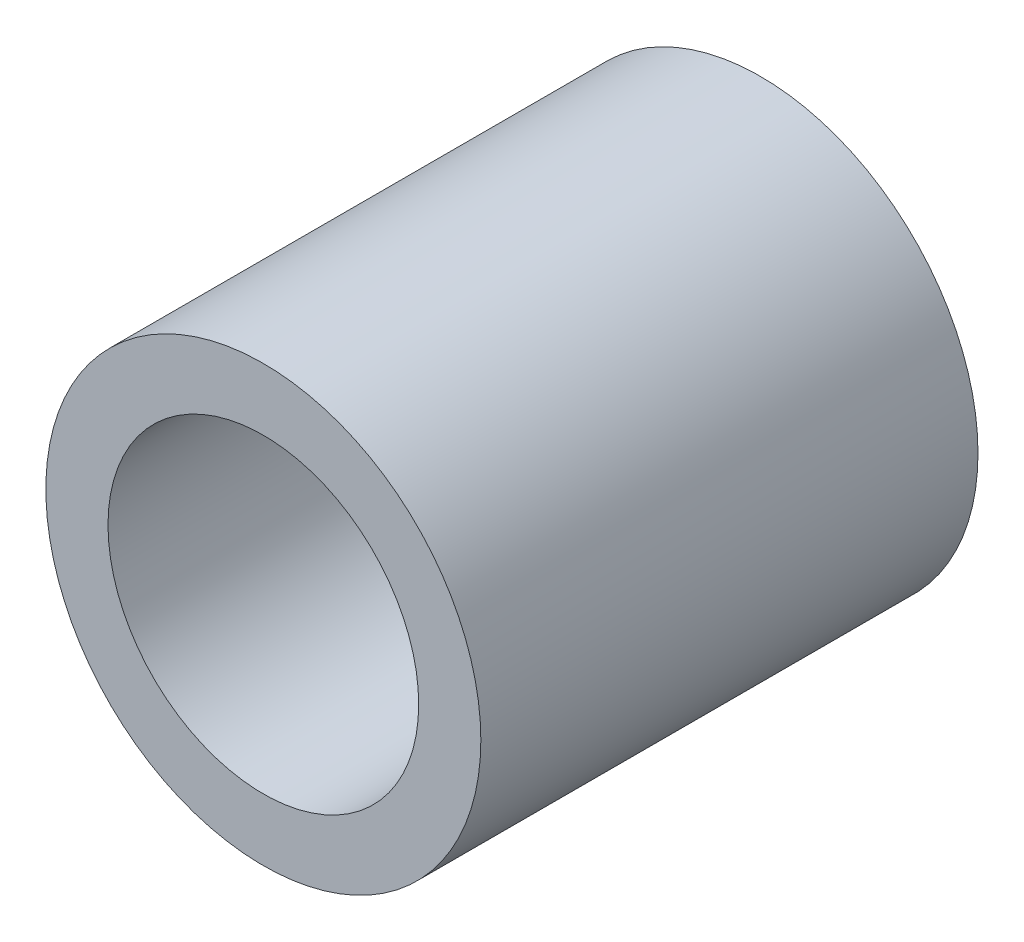
ISO-10303-21;
HEADER;
FILE_DESCRIPTION(('STEP AP214'),'2;1');
FILE_NAME('part.step','',(''),(''),'','','');
FILE_SCHEMA(('AUTOMOTIVE_DESIGN { 1 0 10303 214 1 1 1 1 }'));
ENDSEC;
DATA;
#1=APPLICATION_CONTEXT('core data for automotive mechanical design processes');
#2=APPLICATION_PROTOCOL_DEFINITION('international standard','automotive_design',2000,#1);
#3=PRODUCT_CONTEXT('',#1,'mechanical');
#4=PRODUCT('Part','Part','',(#3));
#5=PRODUCT_RELATED_PRODUCT_CATEGORY('part','',(#4));
#6=PRODUCT_DEFINITION_FORMATION('','',#4);
#7=PRODUCT_DEFINITION_CONTEXT('part definition',#1,'design');
#8=PRODUCT_DEFINITION('design','',#6,#7);
#9=PRODUCT_DEFINITION_SHAPE('','',#8);
#10=(LENGTH_UNIT() NAMED_UNIT(*) SI_UNIT(.MILLI.,.METRE.));
#11=(NAMED_UNIT(*) PLANE_ANGLE_UNIT() SI_UNIT($,.RADIAN.));
#12=(NAMED_UNIT(*) SI_UNIT($,.STERADIAN.) SOLID_ANGLE_UNIT());
#13=UNCERTAINTY_MEASURE_WITH_UNIT(LENGTH_MEASURE(1.E-05),#10,'distance_accuracy_value','');
#14=(GEOMETRIC_REPRESENTATION_CONTEXT(3) GLOBAL_UNCERTAINTY_ASSIGNED_CONTEXT((#13)) GLOBAL_UNIT_ASSIGNED_CONTEXT((#10,
#11,#12)) REPRESENTATION_CONTEXT('',''));
#15=CARTESIAN_POINT('',(0.,0.,0.));
#16=DIRECTION('',(0.,0.,1.));
#17=DIRECTION('',(1.,0.,0.));
#18=AXIS2_PLACEMENT_3D('',#15,#16,#17);
#19=CARTESIAN_POINT('',(0.,0.,25.4));
#20=DIRECTION('',(0.,0.,1.));
#21=DIRECTION('',(1.,0.,0.));
#22=AXIS2_PLACEMENT_3D('',#19,#20,#21);
#23=PLANE('',#22);
#24=CARTESIAN_POINT('',(0.,0.,25.4));
#25=DIRECTION('',(0.,0.,1.));
#26=DIRECTION('',(1.,0.,0.));
#27=AXIS2_PLACEMENT_3D('',#24,#25,#26);
#28=CIRCLE('',#27,11.1125);
#29=CARTESIAN_POINT('',(11.1125,0.,25.4));
#30=VERTEX_POINT('',#29);
#31=EDGE_CURVE('E10',#30,#30,#28,.T.);
#32=ORIENTED_EDGE('',*,*,#31,.T.);
#33=EDGE_LOOP('',(#32));
#34=FACE_BOUND('',#33,.T.);
#35=CARTESIAN_POINT('',(0.,0.,25.4));
#36=DIRECTION('',(0.,0.,1.));
#37=DIRECTION('',(1.,0.,0.));
#38=AXIS2_PLACEMENT_3D('',#35,#36,#37);
#39=CIRCLE('',#38,7.9375);
#40=CARTESIAN_POINT('',(7.9375,0.,25.4));
#41=VERTEX_POINT('',#40);
#42=EDGE_CURVE('E56',#41,#41,#39,.T.);
#43=ORIENTED_EDGE('',*,*,#42,.F.);
#44=EDGE_LOOP('',(#43));
#45=FACE_BOUND('',#44,.T.);
#46=ADVANCED_FACE('F43',(#34,#45),#23,.T.);
#47=CARTESIAN_POINT('',(0.,0.,0.));
#48=DIRECTION('',(0.,0.,1.));
#49=DIRECTION('',(1.,0.,0.));
#50=AXIS2_PLACEMENT_3D('',#47,#48,#49);
#51=PLANE('',#50);
#52=CARTESIAN_POINT('',(0.,0.,0.));
#53=DIRECTION('',(0.,0.,1.));
#54=DIRECTION('',(1.,0.,0.));
#55=AXIS2_PLACEMENT_3D('',#52,#53,#54);
#56=CIRCLE('',#55,11.1125);
#57=CARTESIAN_POINT('',(11.1125,0.,0.));
#58=VERTEX_POINT('',#57);
#59=EDGE_CURVE('E47',#58,#58,#56,.T.);
#60=ORIENTED_EDGE('',*,*,#59,.F.);
#61=EDGE_LOOP('',(#60));
#62=FACE_BOUND('',#61,.T.);
#63=CARTESIAN_POINT('',(0.,0.,0.));
#64=DIRECTION('',(0.,0.,1.));
#65=DIRECTION('',(1.,0.,0.));
#66=AXIS2_PLACEMENT_3D('',#63,#64,#65);
#67=CIRCLE('',#66,7.9375);
#68=CARTESIAN_POINT('',(7.9375,0.,0.));
#69=VERTEX_POINT('',#68);
#70=EDGE_CURVE('E58',#69,#69,#67,.T.);
#71=ORIENTED_EDGE('',*,*,#70,.T.);
#72=EDGE_LOOP('',(#71));
#73=FACE_BOUND('',#72,.T.);
#74=ADVANCED_FACE('F70',(#62,#73),#51,.F.);
#75=CARTESIAN_POINT('',(0.,0.,25.4));
#76=DIRECTION('',(0.,0.,-1.));
#77=DIRECTION('',(-1.,0.,0.));
#78=AXIS2_PLACEMENT_3D('',#75,#76,#77);
#79=CYLINDRICAL_SURFACE('',#78,11.1125);
#80=ORIENTED_EDGE('',*,*,#31,.F.);
#81=EDGE_LOOP('',(#80));
#82=FACE_BOUND('',#81,.T.);
#83=ORIENTED_EDGE('',*,*,#59,.T.);
#84=EDGE_LOOP('',(#83));
#85=FACE_BOUND('',#84,.T.);
#86=ADVANCED_FACE('F45',(#82,#85),#79,.T.);
#87=CARTESIAN_POINT('',(0.,0.,25.4));
#88=DIRECTION('',(0.,0.,-1.));
#89=DIRECTION('',(-1.,0.,0.));
#90=AXIS2_PLACEMENT_3D('',#87,#88,#89);
#91=CYLINDRICAL_SURFACE('',#90,7.9375);
#92=ORIENTED_EDGE('',*,*,#42,.T.);
#93=EDGE_LOOP('',(#92));
#94=FACE_BOUND('',#93,.T.);
#95=ORIENTED_EDGE('',*,*,#70,.F.);
#96=EDGE_LOOP('',(#95));
#97=FACE_BOUND('',#96,.T.);
#98=ADVANCED_FACE('F66',(#94,#97),#91,.F.);
#99=CLOSED_SHELL('',(#46,#74,#86,#98));
#100=MANIFOLD_SOLID_BREP('B2',#99);
#101=ADVANCED_BREP_SHAPE_REPRESENTATION('',(#18,#100),#14);
#102=SHAPE_DEFINITION_REPRESENTATION(#9,#101);
ENDSEC;
END-ISO-10303-21;
